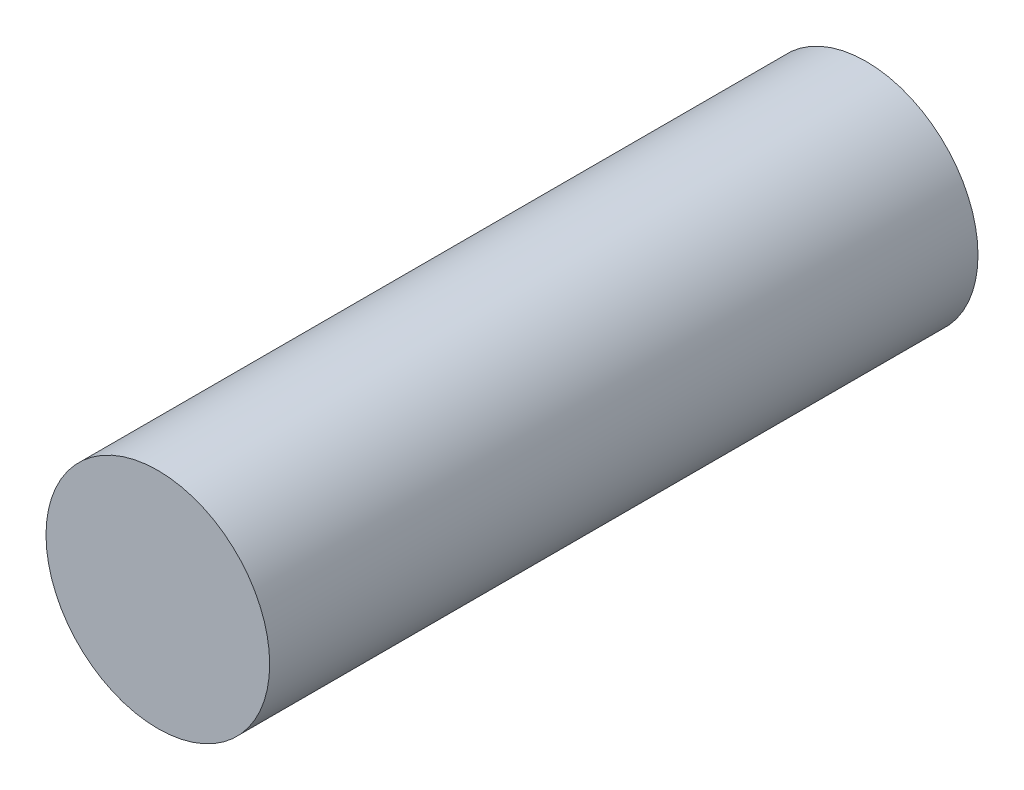
ISO-10303-21;
HEADER;
FILE_DESCRIPTION(('STEP AP214'),'2;1');
FILE_NAME('part.step','',(''),(''),'','','');
FILE_SCHEMA(('AUTOMOTIVE_DESIGN { 1 0 10303 214 1 1 1 1 }'));
ENDSEC;
DATA;
#1=APPLICATION_CONTEXT('core data for automotive mechanical design processes');
#2=APPLICATION_PROTOCOL_DEFINITION('international standard','automotive_design',2000,#1);
#3=PRODUCT_CONTEXT('',#1,'mechanical');
#4=PRODUCT('Part','Part','',(#3));
#5=PRODUCT_RELATED_PRODUCT_CATEGORY('part','',(#4));
#6=PRODUCT_DEFINITION_FORMATION('','',#4);
#7=PRODUCT_DEFINITION_CONTEXT('part definition',#1,'design');
#8=PRODUCT_DEFINITION('design','',#6,#7);
#9=PRODUCT_DEFINITION_SHAPE('','',#8);
#10=(LENGTH_UNIT() NAMED_UNIT(*) SI_UNIT(.MILLI.,.METRE.));
#11=(NAMED_UNIT(*) PLANE_ANGLE_UNIT() SI_UNIT($,.RADIAN.));
#12=(NAMED_UNIT(*) SI_UNIT($,.STERADIAN.) SOLID_ANGLE_UNIT());
#13=UNCERTAINTY_MEASURE_WITH_UNIT(LENGTH_MEASURE(1.E-05),#10,'distance_accuracy_value','');
#14=(GEOMETRIC_REPRESENTATION_CONTEXT(3) GLOBAL_UNCERTAINTY_ASSIGNED_CONTEXT((#13)) GLOBAL_UNIT_ASSIGNED_CONTEXT((#10,
#11,#12)) REPRESENTATION_CONTEXT('',''));
#15=CARTESIAN_POINT('',(0.,0.,0.));
#16=DIRECTION('',(0.,0.,1.));
#17=DIRECTION('',(1.,0.,0.));
#18=AXIS2_PLACEMENT_3D('',#15,#16,#17);
#19=CARTESIAN_POINT('',(-54.5716045909526,30.0340125986178,190.));
#20=DIRECTION('',(0.,0.,-1.));
#21=DIRECTION('',(-1.,0.,0.));
#22=AXIS2_PLACEMENT_3D('',#19,#20,#21);
#23=CYLINDRICAL_SURFACE('',#22,30.);
#24=CARTESIAN_POINT('',(-54.5716045909526,30.0340125986178,190.));
#25=DIRECTION('',(0.,0.,1.));
#26=DIRECTION('',(1.,0.,0.));
#27=AXIS2_PLACEMENT_3D('',#24,#25,#26);
#28=CIRCLE('',#27,30.);
#29=CARTESIAN_POINT('',(-24.5716045909526,30.0340125986178,190.));
#30=VERTEX_POINT('',#29);
#31=EDGE_CURVE('E10',#30,#30,#28,.T.);
#32=ORIENTED_EDGE('',*,*,#31,.F.);
#33=EDGE_LOOP('',(#32));
#34=FACE_BOUND('',#33,.T.);
#35=CARTESIAN_POINT('',(-54.5716045909526,30.0340125986178,0.));
#36=DIRECTION('',(0.,0.,1.));
#37=DIRECTION('',(1.,0.,0.));
#38=AXIS2_PLACEMENT_3D('',#35,#36,#37);
#39=CIRCLE('',#38,30.);
#40=CARTESIAN_POINT('',(-24.5716045909526,30.0340125986178,0.));
#41=VERTEX_POINT('',#40);
#42=EDGE_CURVE('E34',#41,#41,#39,.T.);
#43=ORIENTED_EDGE('',*,*,#42,.T.);
#44=EDGE_LOOP('',(#43));
#45=FACE_BOUND('',#44,.T.);
#46=ADVANCED_FACE('F31',(#34,#45),#23,.T.);
#47=CARTESIAN_POINT('',(-54.5716045909526,30.0340125986178,190.));
#48=DIRECTION('',(0.,0.,1.));
#49=DIRECTION('',(1.,0.,0.));
#50=AXIS2_PLACEMENT_3D('',#47,#48,#49);
#51=PLANE('',#50);
#52=ORIENTED_EDGE('',*,*,#31,.T.);
#53=EDGE_LOOP('',(#52));
#54=FACE_BOUND('',#53,.T.);
#55=ADVANCED_FACE('F46',(#54),#51,.T.);
#56=CARTESIAN_POINT('',(-54.5716045909526,30.0340125986178,0.));
#57=DIRECTION('',(0.,0.,1.));
#58=DIRECTION('',(1.,0.,0.));
#59=AXIS2_PLACEMENT_3D('',#56,#57,#58);
#60=PLANE('',#59);
#61=ORIENTED_EDGE('',*,*,#42,.F.);
#62=EDGE_LOOP('',(#61));
#63=FACE_BOUND('',#62,.T.);
#64=ADVANCED_FACE('F44',(#63),#60,.F.);
#65=CLOSED_SHELL('',(#46,#55,#64));
#66=MANIFOLD_SOLID_BREP('B2',#65);
#67=ADVANCED_BREP_SHAPE_REPRESENTATION('',(#18,#66),#14);
#68=SHAPE_DEFINITION_REPRESENTATION(#9,#67);
ENDSEC;
END-ISO-10303-21;
